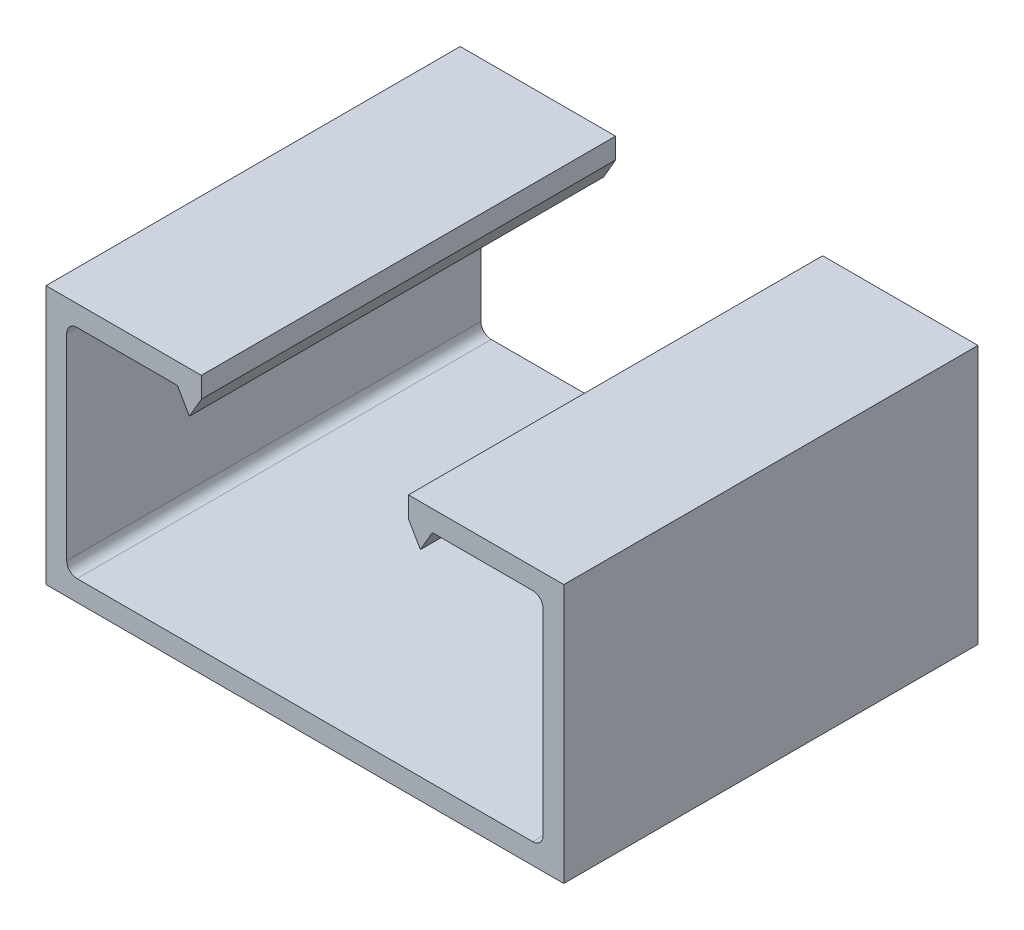
ISO-10303-21;
HEADER;
FILE_DESCRIPTION(('STEP AP214'),'2;1');
FILE_NAME('part.step','',(''),(''),'','','');
FILE_SCHEMA(('AUTOMOTIVE_DESIGN { 1 0 10303 214 1 1 1 1 }'));
ENDSEC;
DATA;
#1=APPLICATION_CONTEXT('core data for automotive mechanical design processes');
#2=APPLICATION_PROTOCOL_DEFINITION('international standard','automotive_design',2000,#1);
#3=PRODUCT_CONTEXT('',#1,'mechanical');
#4=PRODUCT('Part','Part','',(#3));
#5=PRODUCT_RELATED_PRODUCT_CATEGORY('part','',(#4));
#6=PRODUCT_DEFINITION_FORMATION('','',#4);
#7=PRODUCT_DEFINITION_CONTEXT('part definition',#1,'design');
#8=PRODUCT_DEFINITION('design','',#6,#7);
#9=PRODUCT_DEFINITION_SHAPE('','',#8);
#10=(LENGTH_UNIT() NAMED_UNIT(*) SI_UNIT(.MILLI.,.METRE.));
#11=(NAMED_UNIT(*) PLANE_ANGLE_UNIT() SI_UNIT($,.RADIAN.));
#12=(NAMED_UNIT(*) SI_UNIT($,.STERADIAN.) SOLID_ANGLE_UNIT());
#13=UNCERTAINTY_MEASURE_WITH_UNIT(LENGTH_MEASURE(1.E-05),#10,'distance_accuracy_value','');
#14=(GEOMETRIC_REPRESENTATION_CONTEXT(3) GLOBAL_UNCERTAINTY_ASSIGNED_CONTEXT((#13)) GLOBAL_UNIT_ASSIGNED_CONTEXT((#10,
#11,#12)) REPRESENTATION_CONTEXT('',''));
#15=CARTESIAN_POINT('',(0.,0.,0.));
#16=DIRECTION('',(0.,0.,1.));
#17=DIRECTION('',(1.,0.,0.));
#18=AXIS2_PLACEMENT_3D('',#15,#16,#17);
#19=CARTESIAN_POINT('',(-13.97,-6.0325,12.7));
#20=DIRECTION('',(0.,0.,-1.));
#21=DIRECTION('',(-1.,0.,0.));
#22=AXIS2_PLACEMENT_3D('',#19,#20,#21);
#23=CYLINDRICAL_SURFACE('',#22,0.635);
#24=CARTESIAN_POINT('',(-13.97,-6.0325,-12.7));
#25=DIRECTION('',(0.,0.,-1.));
#26=DIRECTION('',(1.,0.,0.));
#27=AXIS2_PLACEMENT_3D('',#24,#25,#26);
#28=CIRCLE('',#27,0.635);
#29=CARTESIAN_POINT('',(-13.97,-6.6675,-12.7));
#30=VERTEX_POINT('',#29);
#31=CARTESIAN_POINT('',(-14.605,-6.0325,-12.7));
#32=VERTEX_POINT('',#31);
#33=EDGE_CURVE('E200',#30,#32,#28,.T.);
#34=ORIENTED_EDGE('',*,*,#33,.T.);
#35=DIRECTION('',(0.,0.,-1.));
#36=VECTOR('',#35,1.);
#37=CARTESIAN_POINT('',(-14.605,-6.0325,12.7));
#38=LINE('',#37,#36);
#39=CARTESIAN_POINT('',(-14.605,-6.0325,12.7));
#40=VERTEX_POINT('',#39);
#41=EDGE_CURVE('E11',#40,#32,#38,.T.);
#42=ORIENTED_EDGE('',*,*,#41,.F.);
#43=CARTESIAN_POINT('',(-13.97,-6.0325,12.7));
#44=DIRECTION('',(0.,0.,-1.));
#45=DIRECTION('',(1.,0.,0.));
#46=AXIS2_PLACEMENT_3D('',#43,#44,#45);
#47=CIRCLE('',#46,0.635);
#48=CARTESIAN_POINT('',(-13.97,-6.6675,12.7));
#49=VERTEX_POINT('',#48);
#50=EDGE_CURVE('E238',#49,#40,#47,.T.);
#51=ORIENTED_EDGE('',*,*,#50,.F.);
#52=DIRECTION('',(0.,0.,-1.));
#53=VECTOR('',#52,1.);
#54=CARTESIAN_POINT('',(-13.97,-6.6675,12.7));
#55=LINE('',#54,#53);
#56=EDGE_CURVE('E196',#49,#30,#55,.T.);
#57=ORIENTED_EDGE('',*,*,#56,.T.);
#58=EDGE_LOOP('',(#34,#42,#51,#57));
#59=FACE_BOUND('',#58,.T.);
#60=ADVANCED_FACE('F32',(#59),#23,.F.);
#61=CARTESIAN_POINT('',(-14.605,6.0325,12.7));
#62=DIRECTION('',(-1.,0.,0.));
#63=DIRECTION('',(0.,-1.,0.));
#64=AXIS2_PLACEMENT_3D('',#61,#62,#63);
#65=PLANE('',#64);
#66=DIRECTION('',(0.,1.,0.));
#67=VECTOR('',#66,1.);
#68=CARTESIAN_POINT('',(-14.605,6.0325,-12.7));
#69=LINE('',#68,#67);
#70=CARTESIAN_POINT('',(-14.605,6.0325,-12.7));
#71=VERTEX_POINT('',#70);
#72=EDGE_CURVE('E203',#32,#71,#69,.T.);
#73=ORIENTED_EDGE('',*,*,#72,.T.);
#74=DIRECTION('',(0.,0.,-1.));
#75=VECTOR('',#74,1.);
#76=CARTESIAN_POINT('',(-14.605,6.0325,12.7));
#77=LINE('',#76,#75);
#78=CARTESIAN_POINT('',(-14.605,6.0325,12.7));
#79=VERTEX_POINT('',#78);
#80=EDGE_CURVE('E40',#79,#71,#77,.T.);
#81=ORIENTED_EDGE('',*,*,#80,.F.);
#82=DIRECTION('',(0.,1.,0.));
#83=VECTOR('',#82,1.);
#84=CARTESIAN_POINT('',(-14.605,6.0325,12.7));
#85=LINE('',#84,#83);
#86=EDGE_CURVE('E127',#40,#79,#85,.T.);
#87=ORIENTED_EDGE('',*,*,#86,.F.);
#88=ORIENTED_EDGE('',*,*,#41,.T.);
#89=EDGE_LOOP('',(#73,#81,#87,#88));
#90=FACE_BOUND('',#89,.T.);
#91=ADVANCED_FACE('F356',(#90),#65,.F.);
#92=CARTESIAN_POINT('',(-13.97,6.0325,12.7));
#93=DIRECTION('',(0.,0.,-1.));
#94=DIRECTION('',(-1.,0.,0.));
#95=AXIS2_PLACEMENT_3D('',#92,#93,#94);
#96=CYLINDRICAL_SURFACE('',#95,0.634999999999998);
#97=CARTESIAN_POINT('',(-13.97,6.0325,-12.7));
#98=DIRECTION('',(0.,0.,-1.));
#99=DIRECTION('',(1.,0.,0.));
#100=AXIS2_PLACEMENT_3D('',#97,#98,#99);
#101=CIRCLE('',#100,0.634999999999998);
#102=CARTESIAN_POINT('',(-13.97,6.6675,-12.7));
#103=VERTEX_POINT('',#102);
#104=EDGE_CURVE('E205',#71,#103,#101,.T.);
#105=ORIENTED_EDGE('',*,*,#104,.T.);
#106=DIRECTION('',(0.,0.,-1.));
#107=VECTOR('',#106,1.);
#108=CARTESIAN_POINT('',(-13.97,6.6675,12.7));
#109=LINE('',#108,#107);
#110=CARTESIAN_POINT('',(-13.97,6.6675,12.7));
#111=VERTEX_POINT('',#110);
#112=EDGE_CURVE('E281',#111,#103,#109,.T.);
#113=ORIENTED_EDGE('',*,*,#112,.F.);
#114=CARTESIAN_POINT('',(-13.97,6.0325,12.7));
#115=DIRECTION('',(0.,0.,-1.));
#116=DIRECTION('',(1.,0.,0.));
#117=AXIS2_PLACEMENT_3D('',#114,#115,#116);
#118=CIRCLE('',#117,0.634999999999998);
#119=EDGE_CURVE('E289',#79,#111,#118,.T.);
#120=ORIENTED_EDGE('',*,*,#119,.F.);
#121=ORIENTED_EDGE('',*,*,#80,.T.);
#122=EDGE_LOOP('',(#105,#113,#120,#121));
#123=FACE_BOUND('',#122,.T.);
#124=ADVANCED_FACE('F287',(#123),#96,.F.);
#125=CARTESIAN_POINT('',(-7.81646968374164,6.6675,12.7));
#126=DIRECTION('',(0.,1.,0.));
#127=DIRECTION('',(-1.,0.,0.));
#128=AXIS2_PLACEMENT_3D('',#125,#126,#127);
#129=PLANE('',#128);
#130=DIRECTION('',(1.,0.,0.));
#131=VECTOR('',#130,1.);
#132=CARTESIAN_POINT('',(-7.81646968374164,6.6675,-12.7));
#133=LINE('',#132,#131);
#134=CARTESIAN_POINT('',(-7.81646968374164,6.6675,-12.7));
#135=VERTEX_POINT('',#134);
#136=EDGE_CURVE('E207',#103,#135,#133,.T.);
#137=ORIENTED_EDGE('',*,*,#136,.T.);
#138=DIRECTION('',(0.,0.,-1.));
#139=VECTOR('',#138,1.);
#140=CARTESIAN_POINT('',(-7.81646968374164,6.6675,12.7));
#141=LINE('',#140,#139);
#142=CARTESIAN_POINT('',(-7.81646968374164,6.6675,12.7));
#143=VERTEX_POINT('',#142);
#144=EDGE_CURVE('E278',#143,#135,#141,.T.);
#145=ORIENTED_EDGE('',*,*,#144,.F.);
#146=DIRECTION('',(1.,0.,0.));
#147=VECTOR('',#146,1.);
#148=CARTESIAN_POINT('',(-7.81646968374164,6.6675,12.7));
#149=LINE('',#148,#147);
#150=EDGE_CURVE('E307',#111,#143,#149,.T.);
#151=ORIENTED_EDGE('',*,*,#150,.F.);
#152=ORIENTED_EDGE('',*,*,#112,.T.);
#153=EDGE_LOOP('',(#137,#145,#151,#152));
#154=FACE_BOUND('',#153,.T.);
#155=ADVANCED_FACE('F298',(#154),#129,.F.);
#156=CARTESIAN_POINT('',(-7.81646968374164,6.6675,12.7));
#157=DIRECTION('',(0.866025404088331,0.499999999473643,0.));
#158=DIRECTION('',(-0.499999999473643,0.866025404088331,0.));
#159=AXIS2_PLACEMENT_3D('',#156,#157,#158);
#160=PLANE('',#159);
#161=DIRECTION('',(0.499999999473643,-0.866025404088331,0.));
#162=VECTOR('',#161,1.);
#163=CARTESIAN_POINT('',(-7.81646968374164,6.6675,-12.7));
#164=LINE('',#163,#162);
#165=CARTESIAN_POINT('',(-7.0832348429,5.3975,-12.7));
#166=VERTEX_POINT('',#165);
#167=EDGE_CURVE('E209',#135,#166,#164,.T.);
#168=ORIENTED_EDGE('',*,*,#167,.T.);
#169=DIRECTION('',(0.,0.,-1.));
#170=VECTOR('',#169,1.);
#171=CARTESIAN_POINT('',(-7.0832348429,5.3975,12.7));
#172=LINE('',#171,#170);
#173=CARTESIAN_POINT('',(-7.0832348429,5.3975,12.7));
#174=VERTEX_POINT('',#173);
#175=EDGE_CURVE('E275',#174,#166,#172,.T.);
#176=ORIENTED_EDGE('',*,*,#175,.F.);
#177=DIRECTION('',(0.499999999473643,-0.866025404088331,0.));
#178=VECTOR('',#177,1.);
#179=CARTESIAN_POINT('',(-7.81646968374164,6.6675,12.7));
#180=LINE('',#179,#178);
#181=EDGE_CURVE('E304',#143,#174,#180,.T.);
#182=ORIENTED_EDGE('',*,*,#181,.F.);
#183=ORIENTED_EDGE('',*,*,#144,.T.);
#184=EDGE_LOOP('',(#168,#176,#182,#183));
#185=FACE_BOUND('',#184,.T.);
#186=ADVANCED_FACE('F302',(#185),#160,.F.);
#187=CARTESIAN_POINT('',(-7.0832348429,5.3975,12.7));
#188=DIRECTION('',(-0.86602540348055,0.500000000526351,0.));
#189=DIRECTION('',(-0.500000000526351,-0.86602540348055,0.));
#190=AXIS2_PLACEMENT_3D('',#187,#188,#189);
#191=PLANE('',#190);
#192=DIRECTION('',(0.500000000526351,0.86602540348055,0.));
#193=VECTOR('',#192,1.);
#194=CARTESIAN_POINT('',(-7.0832348429,5.3975,-12.7));
#195=LINE('',#194,#193);
#196=CARTESIAN_POINT('',(-6.35,6.6675,-12.7));
#197=VERTEX_POINT('',#196);
#198=EDGE_CURVE('E211',#166,#197,#195,.T.);
#199=ORIENTED_EDGE('',*,*,#198,.T.);
#200=DIRECTION('',(0.,0.,-1.));
#201=VECTOR('',#200,1.);
#202=CARTESIAN_POINT('',(-6.35,6.6675,12.7));
#203=LINE('',#202,#201);
#204=CARTESIAN_POINT('',(-6.35,6.6675,12.7));
#205=VERTEX_POINT('',#204);
#206=EDGE_CURVE('E272',#205,#197,#203,.T.);
#207=ORIENTED_EDGE('',*,*,#206,.F.);
#208=DIRECTION('',(0.500000000526351,0.86602540348055,0.));
#209=VECTOR('',#208,1.);
#210=CARTESIAN_POINT('',(-7.0832348429,5.3975,12.7));
#211=LINE('',#210,#209);
#212=EDGE_CURVE('E306',#174,#205,#211,.T.);
#213=ORIENTED_EDGE('',*,*,#212,.F.);
#214=ORIENTED_EDGE('',*,*,#175,.T.);
#215=EDGE_LOOP('',(#199,#207,#213,#214));
#216=FACE_BOUND('',#215,.T.);
#217=ADVANCED_FACE('F369',(#216),#191,.F.);
#218=CARTESIAN_POINT('',(-6.35,6.6675,12.7));
#219=DIRECTION('',(-1.,0.,0.));
#220=DIRECTION('',(0.,-1.,0.));
#221=AXIS2_PLACEMENT_3D('',#218,#219,#220);
#222=PLANE('',#221);
#223=DIRECTION('',(0.,1.,0.));
#224=VECTOR('',#223,1.);
#225=CARTESIAN_POINT('',(-6.35,6.6675,-12.7));
#226=LINE('',#225,#224);
#227=CARTESIAN_POINT('',(-6.35,7.9375,-12.7));
#228=VERTEX_POINT('',#227);
#229=EDGE_CURVE('E213',#197,#228,#226,.T.);
#230=ORIENTED_EDGE('',*,*,#229,.T.);
#231=DIRECTION('',(0.,0.,-1.));
#232=VECTOR('',#231,1.);
#233=CARTESIAN_POINT('',(-6.35,7.9375,12.7));
#234=LINE('',#233,#232);
#235=CARTESIAN_POINT('',(-6.35,7.9375,12.7));
#236=VERTEX_POINT('',#235);
#237=EDGE_CURVE('E269',#236,#228,#234,.T.);
#238=ORIENTED_EDGE('',*,*,#237,.F.);
#239=DIRECTION('',(0.,1.,0.));
#240=VECTOR('',#239,1.);
#241=CARTESIAN_POINT('',(-6.35,6.6675,12.7));
#242=LINE('',#241,#240);
#243=EDGE_CURVE('E309',#205,#236,#242,.T.);
#244=ORIENTED_EDGE('',*,*,#243,.F.);
#245=ORIENTED_EDGE('',*,*,#206,.T.);
#246=EDGE_LOOP('',(#230,#238,#244,#245));
#247=FACE_BOUND('',#246,.T.);
#248=ADVANCED_FACE('F372',(#247),#222,.F.);
#249=CARTESIAN_POINT('',(-6.35,7.9375,12.7));
#250=DIRECTION('',(0.,-1.,0.));
#251=DIRECTION('',(1.,0.,0.));
#252=AXIS2_PLACEMENT_3D('',#249,#250,#251);
#253=PLANE('',#252);
#254=DIRECTION('',(-1.,0.,0.));
#255=VECTOR('',#254,1.);
#256=CARTESIAN_POINT('',(-6.35,7.9375,-12.7));
#257=LINE('',#256,#255);
#258=CARTESIAN_POINT('',(-15.875,7.9375,-12.7));
#259=VERTEX_POINT('',#258);
#260=EDGE_CURVE('E215',#228,#259,#257,.T.);
#261=ORIENTED_EDGE('',*,*,#260,.T.);
#262=DIRECTION('',(0.,0.,-1.));
#263=VECTOR('',#262,1.);
#264=CARTESIAN_POINT('',(-15.875,7.9375,12.7));
#265=LINE('',#264,#263);
#266=CARTESIAN_POINT('',(-15.875,7.9375,12.7));
#267=VERTEX_POINT('',#266);
#268=EDGE_CURVE('E266',#267,#259,#265,.T.);
#269=ORIENTED_EDGE('',*,*,#268,.F.);
#270=DIRECTION('',(-1.,0.,0.));
#271=VECTOR('',#270,1.);
#272=CARTESIAN_POINT('',(-6.35,7.9375,12.7));
#273=LINE('',#272,#271);
#274=EDGE_CURVE('E315',#236,#267,#273,.T.);
#275=ORIENTED_EDGE('',*,*,#274,.F.);
#276=ORIENTED_EDGE('',*,*,#237,.T.);
#277=EDGE_LOOP('',(#261,#269,#275,#276));
#278=FACE_BOUND('',#277,.T.);
#279=ADVANCED_FACE('F376',(#278),#253,.F.);
#280=CARTESIAN_POINT('',(-15.875,7.9375,12.7));
#281=DIRECTION('',(1.,0.,0.));
#282=DIRECTION('',(0.,1.,0.));
#283=AXIS2_PLACEMENT_3D('',#280,#281,#282);
#284=PLANE('',#283);
#285=DIRECTION('',(0.,-1.,0.));
#286=VECTOR('',#285,1.);
#287=CARTESIAN_POINT('',(-15.875,7.9375,-12.7));
#288=LINE('',#287,#286);
#289=CARTESIAN_POINT('',(-15.875,-7.9375,-12.7));
#290=VERTEX_POINT('',#289);
#291=EDGE_CURVE('E217',#259,#290,#288,.T.);
#292=ORIENTED_EDGE('',*,*,#291,.T.);
#293=DIRECTION('',(0.,0.,-1.));
#294=VECTOR('',#293,1.);
#295=CARTESIAN_POINT('',(-15.875,-7.9375,12.7));
#296=LINE('',#295,#294);
#297=CARTESIAN_POINT('',(-15.875,-7.9375,12.7));
#298=VERTEX_POINT('',#297);
#299=EDGE_CURVE('E263',#298,#290,#296,.T.);
#300=ORIENTED_EDGE('',*,*,#299,.F.);
#301=DIRECTION('',(0.,-1.,0.));
#302=VECTOR('',#301,1.);
#303=CARTESIAN_POINT('',(-15.875,7.9375,12.7));
#304=LINE('',#303,#302);
#305=EDGE_CURVE('E317',#267,#298,#304,.T.);
#306=ORIENTED_EDGE('',*,*,#305,.F.);
#307=ORIENTED_EDGE('',*,*,#268,.T.);
#308=EDGE_LOOP('',(#292,#300,#306,#307));
#309=FACE_BOUND('',#308,.T.);
#310=ADVANCED_FACE('F380',(#309),#284,.F.);
#311=CARTESIAN_POINT('',(-15.875,-7.9375,12.7));
#312=DIRECTION('',(0.,1.,0.));
#313=DIRECTION('',(0.,0.,1.));
#314=AXIS2_PLACEMENT_3D('',#311,#312,#313);
#315=PLANE('',#314);
#316=DIRECTION('',(1.,0.,0.));
#317=VECTOR('',#316,1.);
#318=CARTESIAN_POINT('',(-15.875,-7.9375,-12.7));
#319=LINE('',#318,#317);
#320=CARTESIAN_POINT('',(15.875,-7.9375,-12.7));
#321=VERTEX_POINT('',#320);
#322=EDGE_CURVE('E219',#290,#321,#319,.T.);
#323=ORIENTED_EDGE('',*,*,#322,.T.);
#324=DIRECTION('',(0.,0.,-1.));
#325=VECTOR('',#324,1.);
#326=CARTESIAN_POINT('',(15.875,-7.9375,12.7));
#327=LINE('',#326,#325);
#328=CARTESIAN_POINT('',(15.875,-7.9375,12.7));
#329=VERTEX_POINT('',#328);
#330=EDGE_CURVE('E260',#329,#321,#327,.T.);
#331=ORIENTED_EDGE('',*,*,#330,.F.);
#332=DIRECTION('',(1.,0.,0.));
#333=VECTOR('',#332,1.);
#334=CARTESIAN_POINT('',(-15.875,-7.9375,12.7));
#335=LINE('',#334,#333);
#336=EDGE_CURVE('E319',#298,#329,#335,.T.);
#337=ORIENTED_EDGE('',*,*,#336,.F.);
#338=ORIENTED_EDGE('',*,*,#299,.T.);
#339=EDGE_LOOP('',(#323,#331,#337,#338));
#340=FACE_BOUND('',#339,.T.);
#341=ADVANCED_FACE('F384',(#340),#315,.F.);
#342=CARTESIAN_POINT('',(15.875,-7.9375,12.7));
#343=DIRECTION('',(-1.,0.,0.));
#344=DIRECTION('',(0.,0.,1.));
#345=AXIS2_PLACEMENT_3D('',#342,#343,#344);
#346=PLANE('',#345);
#347=DIRECTION('',(0.,1.,0.));
#348=VECTOR('',#347,1.);
#349=CARTESIAN_POINT('',(15.875,-7.9375,-12.7));
#350=LINE('',#349,#348);
#351=CARTESIAN_POINT('',(15.875,7.9375,-12.7));
#352=VERTEX_POINT('',#351);
#353=EDGE_CURVE('E221',#321,#352,#350,.T.);
#354=ORIENTED_EDGE('',*,*,#353,.T.);
#355=DIRECTION('',(0.,0.,-1.));
#356=VECTOR('',#355,1.);
#357=CARTESIAN_POINT('',(15.875,7.9375,12.7));
#358=LINE('',#357,#356);
#359=CARTESIAN_POINT('',(15.875,7.9375,12.7));
#360=VERTEX_POINT('',#359);
#361=EDGE_CURVE('E257',#360,#352,#358,.T.);
#362=ORIENTED_EDGE('',*,*,#361,.F.);
#363=DIRECTION('',(0.,1.,0.));
#364=VECTOR('',#363,1.);
#365=CARTESIAN_POINT('',(15.875,-7.9375,12.7));
#366=LINE('',#365,#364);
#367=EDGE_CURVE('E321',#329,#360,#366,.T.);
#368=ORIENTED_EDGE('',*,*,#367,.F.);
#369=ORIENTED_EDGE('',*,*,#330,.T.);
#370=EDGE_LOOP('',(#354,#362,#368,#369));
#371=FACE_BOUND('',#370,.T.);
#372=ADVANCED_FACE('F388',(#371),#346,.F.);
#373=CARTESIAN_POINT('',(15.875,7.9375,12.7));
#374=DIRECTION('',(0.,-1.,0.));
#375=DIRECTION('',(0.,0.,-1.));
#376=AXIS2_PLACEMENT_3D('',#373,#374,#375);
#377=PLANE('',#376);
#378=DIRECTION('',(-1.,0.,0.));
#379=VECTOR('',#378,1.);
#380=CARTESIAN_POINT('',(15.875,7.9375,-12.7));
#381=LINE('',#380,#379);
#382=CARTESIAN_POINT('',(6.34999999999999,7.9375,-12.7));
#383=VERTEX_POINT('',#382);
#384=EDGE_CURVE('E223',#352,#383,#381,.T.);
#385=ORIENTED_EDGE('',*,*,#384,.T.);
#386=DIRECTION('',(0.,0.,-1.));
#387=VECTOR('',#386,1.);
#388=CARTESIAN_POINT('',(6.34999999999999,7.9375,12.7));
#389=LINE('',#388,#387);
#390=CARTESIAN_POINT('',(6.34999999999999,7.9375,12.7));
#391=VERTEX_POINT('',#390);
#392=EDGE_CURVE('E254',#391,#383,#389,.T.);
#393=ORIENTED_EDGE('',*,*,#392,.F.);
#394=DIRECTION('',(-1.,0.,0.));
#395=VECTOR('',#394,1.);
#396=CARTESIAN_POINT('',(15.875,7.9375,12.7));
#397=LINE('',#396,#395);
#398=EDGE_CURVE('E323',#360,#391,#397,.T.);
#399=ORIENTED_EDGE('',*,*,#398,.F.);
#400=ORIENTED_EDGE('',*,*,#361,.T.);
#401=EDGE_LOOP('',(#385,#393,#399,#400));
#402=FACE_BOUND('',#401,.T.);
#403=ADVANCED_FACE('F392',(#402),#377,.F.);
#404=CARTESIAN_POINT('',(6.34999999999999,6.6675,12.7));
#405=DIRECTION('',(1.,0.,0.));
#406=DIRECTION('',(0.,0.,-1.));
#407=AXIS2_PLACEMENT_3D('',#404,#405,#406);
#408=PLANE('',#407);
#409=DIRECTION('',(0.,-1.,0.));
#410=VECTOR('',#409,1.);
#411=CARTESIAN_POINT('',(6.34999999999999,6.6675,-12.7));
#412=LINE('',#411,#410);
#413=CARTESIAN_POINT('',(6.34999999999999,6.6675,-12.7));
#414=VERTEX_POINT('',#413);
#415=EDGE_CURVE('E225',#383,#414,#412,.T.);
#416=ORIENTED_EDGE('',*,*,#415,.T.);
#417=DIRECTION('',(0.,0.,-1.));
#418=VECTOR('',#417,1.);
#419=CARTESIAN_POINT('',(6.34999999999999,6.6675,12.7));
#420=LINE('',#419,#418);
#421=CARTESIAN_POINT('',(6.34999999999999,6.6675,12.7));
#422=VERTEX_POINT('',#421);
#423=EDGE_CURVE('E251',#422,#414,#420,.T.);
#424=ORIENTED_EDGE('',*,*,#423,.F.);
#425=DIRECTION('',(0.,-1.,0.));
#426=VECTOR('',#425,1.);
#427=CARTESIAN_POINT('',(6.34999999999999,6.6675,12.7));
#428=LINE('',#427,#426);
#429=EDGE_CURVE('E325',#391,#422,#428,.T.);
#430=ORIENTED_EDGE('',*,*,#429,.F.);
#431=ORIENTED_EDGE('',*,*,#392,.T.);
#432=EDGE_LOOP('',(#416,#424,#430,#431));
#433=FACE_BOUND('',#432,.T.);
#434=ADVANCED_FACE('F396',(#433),#408,.F.);
#435=CARTESIAN_POINT('',(7.0832348429,5.3975,12.7));
#436=DIRECTION('',(0.866025403480548,0.500000000526354,0.));
#437=DIRECTION('',(-0.500000000526354,0.866025403480548,0.));
#438=AXIS2_PLACEMENT_3D('',#435,#436,#437);
#439=PLANE('',#438);
#440=DIRECTION('',(0.500000000526354,-0.866025403480548,0.));
#441=VECTOR('',#440,1.);
#442=CARTESIAN_POINT('',(7.0832348429,5.3975,-12.7));
#443=LINE('',#442,#441);
#444=CARTESIAN_POINT('',(7.0832348429,5.3975,-12.7));
#445=VERTEX_POINT('',#444);
#446=EDGE_CURVE('E227',#414,#445,#443,.T.);
#447=ORIENTED_EDGE('',*,*,#446,.T.);
#448=DIRECTION('',(0.,0.,-1.));
#449=VECTOR('',#448,1.);
#450=CARTESIAN_POINT('',(7.0832348429,5.3975,12.7));
#451=LINE('',#450,#449);
#452=CARTESIAN_POINT('',(7.0832348429,5.3975,12.7));
#453=VERTEX_POINT('',#452);
#454=EDGE_CURVE('E248',#453,#445,#451,.T.);
#455=ORIENTED_EDGE('',*,*,#454,.F.);
#456=DIRECTION('',(0.500000000526354,-0.866025403480548,0.));
#457=VECTOR('',#456,1.);
#458=CARTESIAN_POINT('',(7.0832348429,5.3975,12.7));
#459=LINE('',#458,#457);
#460=EDGE_CURVE('E327',#422,#453,#459,.T.);
#461=ORIENTED_EDGE('',*,*,#460,.F.);
#462=ORIENTED_EDGE('',*,*,#423,.T.);
#463=EDGE_LOOP('',(#447,#455,#461,#462));
#464=FACE_BOUND('',#463,.T.);
#465=ADVANCED_FACE('F400',(#464),#439,.F.);
#466=CARTESIAN_POINT('',(7.81646968374164,6.6675,12.7));
#467=DIRECTION('',(-0.866025404088332,0.499999999473642,0.));
#468=DIRECTION('',(-0.499999999473642,-0.866025404088332,0.));
#469=AXIS2_PLACEMENT_3D('',#466,#467,#468);
#470=PLANE('',#469);
#471=DIRECTION('',(0.499999999473642,0.866025404088332,0.));
#472=VECTOR('',#471,1.);
#473=CARTESIAN_POINT('',(7.81646968374164,6.6675,-12.7));
#474=LINE('',#473,#472);
#475=CARTESIAN_POINT('',(7.81646968374164,6.6675,-12.7));
#476=VERTEX_POINT('',#475);
#477=EDGE_CURVE('E229',#445,#476,#474,.T.);
#478=ORIENTED_EDGE('',*,*,#477,.T.);
#479=DIRECTION('',(0.,0.,-1.));
#480=VECTOR('',#479,1.);
#481=CARTESIAN_POINT('',(7.81646968374164,6.6675,12.7));
#482=LINE('',#481,#480);
#483=CARTESIAN_POINT('',(7.81646968374164,6.6675,12.7));
#484=VERTEX_POINT('',#483);
#485=EDGE_CURVE('E245',#484,#476,#482,.T.);
#486=ORIENTED_EDGE('',*,*,#485,.F.);
#487=DIRECTION('',(0.499999999473642,0.866025404088332,0.));
#488=VECTOR('',#487,1.);
#489=CARTESIAN_POINT('',(7.81646968374164,6.6675,12.7));
#490=LINE('',#489,#488);
#491=EDGE_CURVE('E329',#453,#484,#490,.T.);
#492=ORIENTED_EDGE('',*,*,#491,.F.);
#493=ORIENTED_EDGE('',*,*,#454,.T.);
#494=EDGE_LOOP('',(#478,#486,#492,#493));
#495=FACE_BOUND('',#494,.T.);
#496=ADVANCED_FACE('F404',(#495),#470,.F.);
#497=CARTESIAN_POINT('',(13.97,6.6675,12.7));
#498=DIRECTION('',(0.,1.,0.));
#499=DIRECTION('',(-1.,0.,0.));
#500=AXIS2_PLACEMENT_3D('',#497,#498,#499);
#501=PLANE('',#500);
#502=DIRECTION('',(1.,0.,0.));
#503=VECTOR('',#502,1.);
#504=CARTESIAN_POINT('',(13.97,6.6675,-12.7));
#505=LINE('',#504,#503);
#506=CARTESIAN_POINT('',(13.97,6.6675,-12.7));
#507=VERTEX_POINT('',#506);
#508=EDGE_CURVE('E231',#476,#507,#505,.T.);
#509=ORIENTED_EDGE('',*,*,#508,.T.);
#510=DIRECTION('',(0.,0.,-1.));
#511=VECTOR('',#510,1.);
#512=CARTESIAN_POINT('',(13.97,6.6675,12.7));
#513=LINE('',#512,#511);
#514=CARTESIAN_POINT('',(13.97,6.6675,12.7));
#515=VERTEX_POINT('',#514);
#516=EDGE_CURVE('E242',#515,#507,#513,.T.);
#517=ORIENTED_EDGE('',*,*,#516,.F.);
#518=DIRECTION('',(1.,0.,0.));
#519=VECTOR('',#518,1.);
#520=CARTESIAN_POINT('',(13.97,6.6675,12.7));
#521=LINE('',#520,#519);
#522=EDGE_CURVE('E331',#484,#515,#521,.T.);
#523=ORIENTED_EDGE('',*,*,#522,.F.);
#524=ORIENTED_EDGE('',*,*,#485,.T.);
#525=EDGE_LOOP('',(#509,#517,#523,#524));
#526=FACE_BOUND('',#525,.T.);
#527=ADVANCED_FACE('F337',(#526),#501,.F.);
#528=CARTESIAN_POINT('',(13.97,6.0325,12.7));
#529=DIRECTION('',(0.,0.,-1.));
#530=DIRECTION('',(-1.,0.,0.));
#531=AXIS2_PLACEMENT_3D('',#528,#529,#530);
#532=CYLINDRICAL_SURFACE('',#531,0.635000000000001);
#533=CARTESIAN_POINT('',(13.97,6.0325,-12.7));
#534=DIRECTION('',(0.,0.,-1.));
#535=DIRECTION('',(1.,0.,0.));
#536=AXIS2_PLACEMENT_3D('',#533,#534,#535);
#537=CIRCLE('',#536,0.635000000000001);
#538=CARTESIAN_POINT('',(14.605,6.0325,-12.7));
#539=VERTEX_POINT('',#538);
#540=EDGE_CURVE('E233',#507,#539,#537,.T.);
#541=ORIENTED_EDGE('',*,*,#540,.T.);
#542=DIRECTION('',(0.,0.,-1.));
#543=VECTOR('',#542,1.);
#544=CARTESIAN_POINT('',(14.605,6.0325,12.7));
#545=LINE('',#544,#543);
#546=CARTESIAN_POINT('',(14.605,6.0325,12.7));
#547=VERTEX_POINT('',#546);
#548=EDGE_CURVE('E191',#547,#539,#545,.T.);
#549=ORIENTED_EDGE('',*,*,#548,.F.);
#550=CARTESIAN_POINT('',(13.97,6.0325,12.7));
#551=DIRECTION('',(0.,0.,-1.));
#552=DIRECTION('',(1.,0.,0.));
#553=AXIS2_PLACEMENT_3D('',#550,#551,#552);
#554=CIRCLE('',#553,0.635000000000001);
#555=EDGE_CURVE('E182',#515,#547,#554,.T.);
#556=ORIENTED_EDGE('',*,*,#555,.F.);
#557=ORIENTED_EDGE('',*,*,#516,.T.);
#558=EDGE_LOOP('',(#541,#549,#556,#557));
#559=FACE_BOUND('',#558,.T.);
#560=ADVANCED_FACE('F341',(#559),#532,.F.);
#561=CARTESIAN_POINT('',(14.605,-6.0325,12.7));
#562=DIRECTION('',(1.,0.,0.));
#563=DIRECTION('',(0.,1.,0.));
#564=AXIS2_PLACEMENT_3D('',#561,#562,#563);
#565=PLANE('',#564);
#566=DIRECTION('',(0.,-1.,0.));
#567=VECTOR('',#566,1.);
#568=CARTESIAN_POINT('',(14.605,-6.0325,-12.7));
#569=LINE('',#568,#567);
#570=CARTESIAN_POINT('',(14.605,-6.0325,-12.7));
#571=VERTEX_POINT('',#570);
#572=EDGE_CURVE('E190',#539,#571,#569,.T.);
#573=ORIENTED_EDGE('',*,*,#572,.T.);
#574=DIRECTION('',(0.,0.,-1.));
#575=VECTOR('',#574,1.);
#576=CARTESIAN_POINT('',(14.605,-6.0325,12.7));
#577=LINE('',#576,#575);
#578=CARTESIAN_POINT('',(14.605,-6.0325,12.7));
#579=VERTEX_POINT('',#578);
#580=EDGE_CURVE('E187',#579,#571,#577,.T.);
#581=ORIENTED_EDGE('',*,*,#580,.F.);
#582=DIRECTION('',(0.,-1.,0.));
#583=VECTOR('',#582,1.);
#584=CARTESIAN_POINT('',(14.605,-6.0325,12.7));
#585=LINE('',#584,#583);
#586=EDGE_CURVE('E176',#547,#579,#585,.T.);
#587=ORIENTED_EDGE('',*,*,#586,.F.);
#588=ORIENTED_EDGE('',*,*,#548,.T.);
#589=EDGE_LOOP('',(#573,#581,#587,#588));
#590=FACE_BOUND('',#589,.T.);
#591=ADVANCED_FACE('F188',(#590),#565,.F.);
#592=CARTESIAN_POINT('',(13.97,-6.0325,12.7));
#593=DIRECTION('',(0.,0.,-1.));
#594=DIRECTION('',(-1.,0.,0.));
#595=AXIS2_PLACEMENT_3D('',#592,#593,#594);
#596=CYLINDRICAL_SURFACE('',#595,0.635000000000001);
#597=CARTESIAN_POINT('',(13.97,-6.0325,-12.7));
#598=DIRECTION('',(0.,0.,-1.));
#599=DIRECTION('',(1.,0.,0.));
#600=AXIS2_PLACEMENT_3D('',#597,#598,#599);
#601=CIRCLE('',#600,0.635000000000001);
#602=CARTESIAN_POINT('',(13.97,-6.6675,-12.7));
#603=VERTEX_POINT('',#602);
#604=EDGE_CURVE('E113',#571,#603,#601,.T.);
#605=ORIENTED_EDGE('',*,*,#604,.T.);
#606=DIRECTION('',(0.,0.,-1.));
#607=VECTOR('',#606,1.);
#608=CARTESIAN_POINT('',(13.97,-6.6675,12.7));
#609=LINE('',#608,#607);
#610=CARTESIAN_POINT('',(13.97,-6.6675,12.7));
#611=VERTEX_POINT('',#610);
#612=EDGE_CURVE('E192',#611,#603,#609,.T.);
#613=ORIENTED_EDGE('',*,*,#612,.F.);
#614=CARTESIAN_POINT('',(13.97,-6.0325,12.7));
#615=DIRECTION('',(0.,0.,-1.));
#616=DIRECTION('',(1.,0.,0.));
#617=AXIS2_PLACEMENT_3D('',#614,#615,#616);
#618=CIRCLE('',#617,0.635000000000001);
#619=EDGE_CURVE('E180',#579,#611,#618,.T.);
#620=ORIENTED_EDGE('',*,*,#619,.F.);
#621=ORIENTED_EDGE('',*,*,#580,.T.);
#622=EDGE_LOOP('',(#605,#613,#620,#621));
#623=FACE_BOUND('',#622,.T.);
#624=ADVANCED_FACE('F194',(#623),#596,.F.);
#625=CARTESIAN_POINT('',(-13.97,-6.6675,12.7));
#626=DIRECTION('',(0.,-1.,0.));
#627=DIRECTION('',(0.,0.,-1.));
#628=AXIS2_PLACEMENT_3D('',#625,#626,#627);
#629=PLANE('',#628);
#630=DIRECTION('',(-1.,0.,0.));
#631=VECTOR('',#630,1.);
#632=CARTESIAN_POINT('',(-13.97,-6.6675,-12.7));
#633=LINE('',#632,#631);
#634=EDGE_CURVE('E119',#603,#30,#633,.T.);
#635=ORIENTED_EDGE('',*,*,#634,.T.);
#636=ORIENTED_EDGE('',*,*,#56,.F.);
#637=DIRECTION('',(-1.,0.,0.));
#638=VECTOR('',#637,1.);
#639=CARTESIAN_POINT('',(-13.97,-6.6675,12.7));
#640=LINE('',#639,#638);
#641=EDGE_CURVE('E48',#611,#49,#640,.T.);
#642=ORIENTED_EDGE('',*,*,#641,.F.);
#643=ORIENTED_EDGE('',*,*,#612,.T.);
#644=EDGE_LOOP('',(#635,#636,#642,#643));
#645=FACE_BOUND('',#644,.T.);
#646=ADVANCED_FACE('F345',(#645),#629,.F.);
#647=CARTESIAN_POINT('',(-13.97,-6.0325,12.7));
#648=DIRECTION('',(0.,0.,1.));
#649=DIRECTION('',(1.,0.,0.));
#650=AXIS2_PLACEMENT_3D('',#647,#648,#649);
#651=PLANE('',#650);
#652=ORIENTED_EDGE('',*,*,#50,.T.);
#653=ORIENTED_EDGE('',*,*,#86,.T.);
#654=ORIENTED_EDGE('',*,*,#119,.T.);
#655=ORIENTED_EDGE('',*,*,#150,.T.);
#656=ORIENTED_EDGE('',*,*,#181,.T.);
#657=ORIENTED_EDGE('',*,*,#212,.T.);
#658=ORIENTED_EDGE('',*,*,#243,.T.);
#659=ORIENTED_EDGE('',*,*,#274,.T.);
#660=ORIENTED_EDGE('',*,*,#305,.T.);
#661=ORIENTED_EDGE('',*,*,#336,.T.);
#662=ORIENTED_EDGE('',*,*,#367,.T.);
#663=ORIENTED_EDGE('',*,*,#398,.T.);
#664=ORIENTED_EDGE('',*,*,#429,.T.);
#665=ORIENTED_EDGE('',*,*,#460,.T.);
#666=ORIENTED_EDGE('',*,*,#491,.T.);
#667=ORIENTED_EDGE('',*,*,#522,.T.);
#668=ORIENTED_EDGE('',*,*,#555,.T.);
#669=ORIENTED_EDGE('',*,*,#586,.T.);
#670=ORIENTED_EDGE('',*,*,#619,.T.);
#671=ORIENTED_EDGE('',*,*,#641,.T.);
#672=EDGE_LOOP('',(#652,#653,#654,#655,#656,#657,#658,#659,#660,#661,#662,#663,#664,#665,#666,
#667,#668,#669,#670,#671));
#673=FACE_BOUND('',#672,.T.);
#674=ADVANCED_FACE('F178',(#673),#651,.T.);
#675=CARTESIAN_POINT('',(-13.97,-6.0325,-12.7));
#676=DIRECTION('',(0.,0.,1.));
#677=DIRECTION('',(1.,0.,0.));
#678=AXIS2_PLACEMENT_3D('',#675,#676,#677);
#679=PLANE('',#678);
#680=ORIENTED_EDGE('',*,*,#33,.F.);
#681=ORIENTED_EDGE('',*,*,#634,.F.);
#682=ORIENTED_EDGE('',*,*,#604,.F.);
#683=ORIENTED_EDGE('',*,*,#572,.F.);
#684=ORIENTED_EDGE('',*,*,#540,.F.);
#685=ORIENTED_EDGE('',*,*,#508,.F.);
#686=ORIENTED_EDGE('',*,*,#477,.F.);
#687=ORIENTED_EDGE('',*,*,#446,.F.);
#688=ORIENTED_EDGE('',*,*,#415,.F.);
#689=ORIENTED_EDGE('',*,*,#384,.F.);
#690=ORIENTED_EDGE('',*,*,#353,.F.);
#691=ORIENTED_EDGE('',*,*,#322,.F.);
#692=ORIENTED_EDGE('',*,*,#291,.F.);
#693=ORIENTED_EDGE('',*,*,#260,.F.);
#694=ORIENTED_EDGE('',*,*,#229,.F.);
#695=ORIENTED_EDGE('',*,*,#198,.F.);
#696=ORIENTED_EDGE('',*,*,#167,.F.);
#697=ORIENTED_EDGE('',*,*,#136,.F.);
#698=ORIENTED_EDGE('',*,*,#104,.F.);
#699=ORIENTED_EDGE('',*,*,#72,.F.);
#700=EDGE_LOOP('',(#680,#681,#682,#683,#684,#685,#686,#687,#688,#689,#690,#691,#692,#693,#694,
#695,#696,#697,#698,#699));
#701=FACE_BOUND('',#700,.T.);
#702=ADVANCED_FACE('F293',(#701),#679,.F.);
#703=CLOSED_SHELL('',(#60,#91,#124,#155,#186,#217,#248,#279,#310,#341,#372,#403,#434,#465,#496,
#527,#560,#591,#624,#646,#674,#702));
#704=MANIFOLD_SOLID_BREP('B2',#703);
#705=ADVANCED_BREP_SHAPE_REPRESENTATION('',(#18,#704),#14);
#706=SHAPE_DEFINITION_REPRESENTATION(#9,#705);
ENDSEC;
END-ISO-10303-21;
